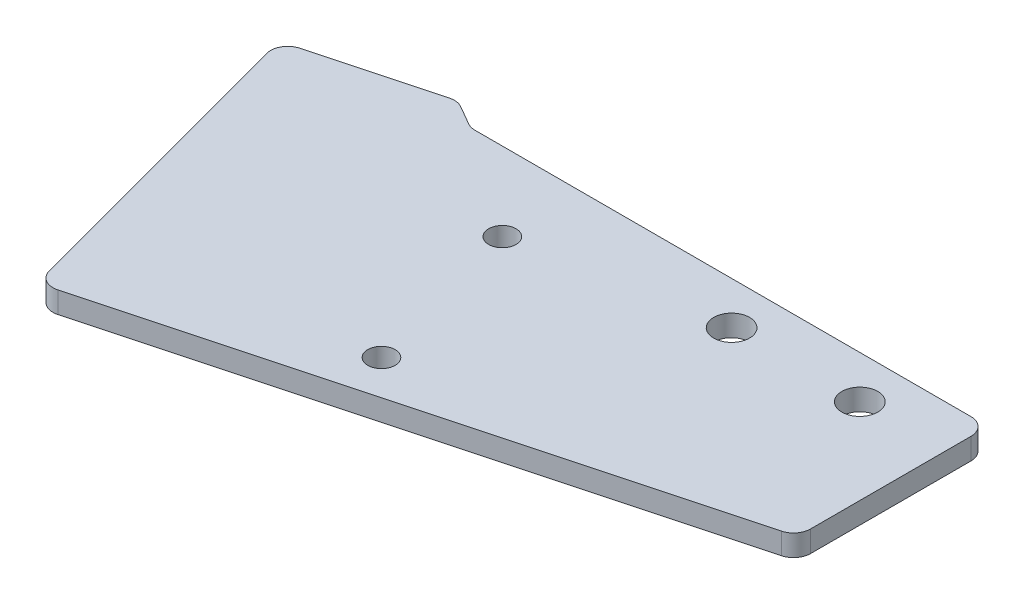
ISO-10303-21;
HEADER;
FILE_DESCRIPTION(('STEP AP214'),'2;1');
FILE_NAME('part.step','',(''),(''),'','','');
FILE_SCHEMA(('AUTOMOTIVE_DESIGN { 1 0 10303 214 1 1 1 1 }'));
ENDSEC;
DATA;
#1=APPLICATION_CONTEXT('core data for automotive mechanical design processes');
#2=APPLICATION_PROTOCOL_DEFINITION('international standard','automotive_design',2000,#1);
#3=PRODUCT_CONTEXT('',#1,'mechanical');
#4=PRODUCT('Part','Part','',(#3));
#5=PRODUCT_RELATED_PRODUCT_CATEGORY('part','',(#4));
#6=PRODUCT_DEFINITION_FORMATION('','',#4);
#7=PRODUCT_DEFINITION_CONTEXT('part definition',#1,'design');
#8=PRODUCT_DEFINITION('design','',#6,#7);
#9=PRODUCT_DEFINITION_SHAPE('','',#8);
#10=(LENGTH_UNIT() NAMED_UNIT(*) SI_UNIT(.MILLI.,.METRE.));
#11=(NAMED_UNIT(*) PLANE_ANGLE_UNIT() SI_UNIT($,.RADIAN.));
#12=(NAMED_UNIT(*) SI_UNIT($,.STERADIAN.) SOLID_ANGLE_UNIT());
#13=UNCERTAINTY_MEASURE_WITH_UNIT(LENGTH_MEASURE(1.E-05),#10,'distance_accuracy_value','');
#14=(GEOMETRIC_REPRESENTATION_CONTEXT(3) GLOBAL_UNCERTAINTY_ASSIGNED_CONTEXT((#13)) GLOBAL_UNIT_ASSIGNED_CONTEXT((#10,
#11,#12)) REPRESENTATION_CONTEXT('',''));
#15=CARTESIAN_POINT('',(0.,0.,0.));
#16=DIRECTION('',(0.,0.,1.));
#17=DIRECTION('',(1.,0.,0.));
#18=AXIS2_PLACEMENT_3D('',#15,#16,#17);
#19=CARTESIAN_POINT('',(0.,2.5,0.));
#20=DIRECTION('',(0.,1.,0.));
#21=DIRECTION('',(0.,0.,1.));
#22=AXIS2_PLACEMENT_3D('',#19,#20,#21);
#23=PLANE('',#22);
#24=CARTESIAN_POINT('',(-30.144179737197,2.5,4.17571846262339));
#25=DIRECTION('',(0.,1.,0.));
#26=DIRECTION('',(0.,0.,1.));
#27=AXIS2_PLACEMENT_3D('',#24,#25,#26);
#28=CIRCLE('',#27,1.6);
#29=CARTESIAN_POINT('',(-30.144179737197,2.5,5.77571846262339));
#30=VERTEX_POINT('',#29);
#31=EDGE_CURVE('E294',#30,#30,#28,.T.);
#32=ORIENTED_EDGE('',*,*,#31,.F.);
#33=EDGE_LOOP('',(#32));
#34=FACE_BOUND('',#33,.T.);
#35=CARTESIAN_POINT('',(-24.9677988351465,2.5,23.4942349884047));
#36=DIRECTION('',(0.,1.,0.));
#37=DIRECTION('',(0.,0.,1.));
#38=AXIS2_PLACEMENT_3D('',#35,#36,#37);
#39=CIRCLE('',#38,1.6);
#40=CARTESIAN_POINT('',(-24.9677988351465,2.5,25.0942349884047));
#41=VERTEX_POINT('',#40);
#42=EDGE_CURVE('E288',#41,#41,#39,.T.);
#43=ORIENTED_EDGE('',*,*,#42,.F.);
#44=EDGE_LOOP('',(#43));
#45=FACE_BOUND('',#44,.T.);
#46=CARTESIAN_POINT('',(-7.5,2.5,0.));
#47=DIRECTION('',(0.,1.,0.));
#48=DIRECTION('',(0.,0.,1.));
#49=AXIS2_PLACEMENT_3D('',#46,#47,#48);
#50=CIRCLE('',#49,2.1);
#51=CARTESIAN_POINT('',(-7.5,2.5,2.1));
#52=VERTEX_POINT('',#51);
#53=EDGE_CURVE('E261',#52,#52,#50,.T.);
#54=ORIENTED_EDGE('',*,*,#53,.F.);
#55=EDGE_LOOP('',(#54));
#56=FACE_BOUND('',#55,.T.);
#57=DIRECTION('',(0.965925826289067,0.,-0.258819045102525));
#58=VECTOR('',#57,1.);
#59=CARTESIAN_POINT('',(5.49512858894879,2.5,20.5080990880808));
#60=LINE('',#59,#58);
#61=CARTESIAN_POINT('',(-50.7196267457278,2.5,35.5707973827208));
#62=VERTEX_POINT('',#61);
#63=CARTESIAN_POINT('',(16.0176380902051,2.5,17.6886011648703));
#64=VERTEX_POINT('',#63);
#65=EDGE_CURVE('E187',#62,#64,#60,.T.);
#66=ORIENTED_EDGE('',*,*,#65,.T.);
#67=CARTESIAN_POINT('',(15.5,2.5,15.7567495122922));
#68=DIRECTION('',(0.,1.,0.));
#69=DIRECTION('',(0.,0.,1.));
#70=AXIS2_PLACEMENT_3D('',#67,#68,#69);
#71=CIRCLE('',#70,2.);
#72=CARTESIAN_POINT('',(17.5,2.5,15.7567495122922));
#73=VERTEX_POINT('',#72);
#74=EDGE_CURVE('E190',#64,#73,#71,.T.);
#75=ORIENTED_EDGE('',*,*,#74,.T.);
#76=DIRECTION('',(0.,0.,-1.));
#77=VECTOR('',#76,1.);
#78=CARTESIAN_POINT('',(17.5,2.5,-5.));
#79=LINE('',#78,#77);
#80=CARTESIAN_POINT('',(17.5,2.5,-3.));
#81=VERTEX_POINT('',#80);
#82=EDGE_CURVE('E257',#73,#81,#79,.T.);
#83=ORIENTED_EDGE('',*,*,#82,.T.);
#84=CARTESIAN_POINT('',(15.5,2.5,-3.));
#85=DIRECTION('',(0.,1.,0.));
#86=DIRECTION('',(0.,0.,1.));
#87=AXIS2_PLACEMENT_3D('',#84,#85,#86);
#88=CIRCLE('',#87,2.);
#89=CARTESIAN_POINT('',(15.5,2.5,-5.));
#90=VERTEX_POINT('',#89);
#91=EDGE_CURVE('E191',#81,#90,#88,.T.);
#92=ORIENTED_EDGE('',*,*,#91,.T.);
#93=DIRECTION('',(-1.,0.,0.));
#94=VECTOR('',#93,1.);
#95=CARTESIAN_POINT('',(-17.5,2.5,-5.));
#96=LINE('',#95,#94);
#97=CARTESIAN_POINT('',(-42.5178706563756,2.5,-5.));
#98=VERTEX_POINT('',#97);
#99=EDGE_CURVE('E240',#90,#98,#96,.T.);
#100=ORIENTED_EDGE('',*,*,#99,.T.);
#101=CARTESIAN_POINT('',(-42.5178706563756,2.5,-7.));
#102=DIRECTION('',(0.,1.,0.));
#103=DIRECTION('',(0.,0.,1.));
#104=AXIS2_PLACEMENT_3D('',#101,#102,#103);
#105=CIRCLE('',#104,2.);
#106=CARTESIAN_POINT('',(-43.5178706563756,2.5,-5.26794919243113));
#107=VERTEX_POINT('',#106);
#108=EDGE_CURVE('E81',#98,#107,#105,.F.);
#109=ORIENTED_EDGE('',*,*,#108,.T.);
#110=DIRECTION('',(0.866025403784438,0.,0.500000000000001));
#111=VECTOR('',#110,1.);
#112=CARTESIAN_POINT('',(-8.59837875084842,2.5,14.89282885919));
#113=LINE('',#112,#111);
#114=CARTESIAN_POINT('',(-45.7603358534579,2.5,-6.56263707761494));
#115=VERTEX_POINT('',#114);
#116=EDGE_CURVE('E237',#107,#115,#113,.F.);
#117=ORIENTED_EDGE('',*,*,#116,.T.);
#118=CARTESIAN_POINT('',(-46.7603358534579,2.5,-4.83058627004606));
#119=DIRECTION('',(0.,1.,0.));
#120=DIRECTION('',(0.,0.,1.));
#121=AXIS2_PLACEMENT_3D('',#118,#119,#120);
#122=CIRCLE('',#121,2.);
#123=CARTESIAN_POINT('',(-47.2779739436629,2.5,-6.76243792262419));
#124=VERTEX_POINT('',#123);
#125=EDGE_CURVE('E193',#115,#124,#122,.T.);
#126=ORIENTED_EDGE('',*,*,#125,.T.);
#127=DIRECTION('',(0.965925826289067,0.,-0.258819045102525));
#128=VECTOR('',#127,1.);
#129=CARTESIAN_POINT('',(-4.85763321515222,2.5,-18.1289339634819));
#130=LINE('',#129,#128);
#131=CARTESIAN_POINT('',(-61.0723885498288,2.5,-3.06623566884191));
#132=VERTEX_POINT('',#131);
#133=EDGE_CURVE('E277',#132,#124,#130,.T.);
#134=ORIENTED_EDGE('',*,*,#133,.F.);
#135=CARTESIAN_POINT('',(-60.5547504596237,2.5,-1.13438401626378));
#136=DIRECTION('',(0.,1.,0.));
#137=DIRECTION('',(0.,0.,1.));
#138=AXIS2_PLACEMENT_3D('',#135,#136,#137);
#139=CIRCLE('',#138,2.);
#140=CARTESIAN_POINT('',(-62.4866021122018,2.5,-0.61674592605874));
#141=VERTEX_POINT('',#140);
#142=EDGE_CURVE('E200',#132,#141,#139,.T.);
#143=ORIENTED_EDGE('',*,*,#142,.T.);
#144=DIRECTION('',(-0.258819045102525,0.,-0.965925826289067));
#145=VECTOR('',#144,1.);
#146=CARTESIAN_POINT('',(-58.1466069872547,2.5,15.580336384845));
#147=LINE('',#146,#145);
#148=CARTESIAN_POINT('',(-53.1691164885109,2.5,34.1565838203477));
#149=VERTEX_POINT('',#148);
#150=EDGE_CURVE('E278',#149,#141,#147,.T.);
#151=ORIENTED_EDGE('',*,*,#150,.F.);
#152=CARTESIAN_POINT('',(-51.2372648359328,2.5,33.6389457301426));
#153=DIRECTION('',(0.,1.,0.));
#154=DIRECTION('',(0.,0.,1.));
#155=AXIS2_PLACEMENT_3D('',#152,#153,#154);
#156=CIRCLE('',#155,2.);
#157=EDGE_CURVE('E202',#149,#62,#156,.T.);
#158=ORIENTED_EDGE('',*,*,#157,.T.);
#159=EDGE_LOOP('',(#66,#75,#83,#92,#100,#109,#117,#126,#134,#143,#151,#158));
#160=FACE_BOUND('',#159,.T.);
#161=CARTESIAN_POINT('',(7.5,2.5,0.));
#162=DIRECTION('',(0.,1.,0.));
#163=DIRECTION('',(0.,0.,1.));
#164=AXIS2_PLACEMENT_3D('',#161,#162,#163);
#165=CIRCLE('',#164,2.1);
#166=CARTESIAN_POINT('',(7.5,2.5,2.1));
#167=VERTEX_POINT('',#166);
#168=EDGE_CURVE('E268',#167,#167,#165,.T.);
#169=ORIENTED_EDGE('',*,*,#168,.F.);
#170=EDGE_LOOP('',(#169));
#171=FACE_BOUND('',#170,.T.);
#172=ADVANCED_FACE('F73',(#34,#45,#56,#160,#171),#23,.T.);
#173=CARTESIAN_POINT('',(0.,0.,0.));
#174=DIRECTION('',(0.,1.,0.));
#175=DIRECTION('',(0.,0.,1.));
#176=AXIS2_PLACEMENT_3D('',#173,#174,#175);
#177=PLANE('',#176);
#178=CARTESIAN_POINT('',(-30.144179737197,0.,4.17571846262339));
#179=DIRECTION('',(0.,1.,0.));
#180=DIRECTION('',(0.,0.,1.));
#181=AXIS2_PLACEMENT_3D('',#178,#179,#180);
#182=CIRCLE('',#181,1.6);
#183=CARTESIAN_POINT('',(-30.144179737197,0.,5.77571846262339));
#184=VERTEX_POINT('',#183);
#185=EDGE_CURVE('E281',#184,#184,#182,.T.);
#186=ORIENTED_EDGE('',*,*,#185,.T.);
#187=EDGE_LOOP('',(#186));
#188=FACE_BOUND('',#187,.T.);
#189=CARTESIAN_POINT('',(-24.9677988351465,0.,23.4942349884047));
#190=DIRECTION('',(0.,1.,0.));
#191=DIRECTION('',(0.,0.,1.));
#192=AXIS2_PLACEMENT_3D('',#189,#190,#191);
#193=CIRCLE('',#192,1.6);
#194=CARTESIAN_POINT('',(-24.9677988351465,0.,25.0942349884047));
#195=VERTEX_POINT('',#194);
#196=EDGE_CURVE('E291',#195,#195,#193,.T.);
#197=ORIENTED_EDGE('',*,*,#196,.T.);
#198=EDGE_LOOP('',(#197));
#199=FACE_BOUND('',#198,.T.);
#200=DIRECTION('',(0.,0.,-1.));
#201=VECTOR('',#200,1.);
#202=CARTESIAN_POINT('',(17.5,0.,-5.));
#203=LINE('',#202,#201);
#204=CARTESIAN_POINT('',(17.5,0.,15.7567495122922));
#205=VERTEX_POINT('',#204);
#206=CARTESIAN_POINT('',(17.5,0.,-3.));
#207=VERTEX_POINT('',#206);
#208=EDGE_CURVE('E171',#205,#207,#203,.T.);
#209=ORIENTED_EDGE('',*,*,#208,.F.);
#210=CARTESIAN_POINT('',(15.5,0.,15.7567495122922));
#211=DIRECTION('',(0.,1.,0.));
#212=DIRECTION('',(0.,0.,1.));
#213=AXIS2_PLACEMENT_3D('',#210,#211,#212);
#214=CIRCLE('',#213,2.);
#215=CARTESIAN_POINT('',(16.0176380902051,0.,17.6886011648703));
#216=VERTEX_POINT('',#215);
#217=EDGE_CURVE('E164',#205,#216,#214,.F.);
#218=ORIENTED_EDGE('',*,*,#217,.T.);
#219=DIRECTION('',(-0.965925826289067,0.,0.258819045102525));
#220=VECTOR('',#219,1.);
#221=CARTESIAN_POINT('',(5.49512858894879,0.,20.5080990880808));
#222=LINE('',#221,#220);
#223=CARTESIAN_POINT('',(-50.7196267457278,0.,35.5707973827208));
#224=VERTEX_POINT('',#223);
#225=EDGE_CURVE('E168',#216,#224,#222,.T.);
#226=ORIENTED_EDGE('',*,*,#225,.T.);
#227=CARTESIAN_POINT('',(-51.2372648359328,0.,33.6389457301426));
#228=DIRECTION('',(0.,1.,0.));
#229=DIRECTION('',(0.,0.,1.));
#230=AXIS2_PLACEMENT_3D('',#227,#228,#229);
#231=CIRCLE('',#230,2.);
#232=CARTESIAN_POINT('',(-53.1691164885109,0.,34.1565838203477));
#233=VERTEX_POINT('',#232);
#234=EDGE_CURVE('E176',#224,#233,#231,.F.);
#235=ORIENTED_EDGE('',*,*,#234,.T.);
#236=DIRECTION('',(0.258819045102525,0.,0.965925826289067));
#237=VECTOR('',#236,1.);
#238=CARTESIAN_POINT('',(-58.1466069872547,0.,15.580336384845));
#239=LINE('',#238,#237);
#240=CARTESIAN_POINT('',(-62.4866021122018,0.,-0.61674592605874));
#241=VERTEX_POINT('',#240);
#242=EDGE_CURVE('E279',#241,#233,#239,.T.);
#243=ORIENTED_EDGE('',*,*,#242,.F.);
#244=CARTESIAN_POINT('',(-60.5547504596237,0.,-1.13438401626378));
#245=DIRECTION('',(0.,1.,0.));
#246=DIRECTION('',(0.,0.,1.));
#247=AXIS2_PLACEMENT_3D('',#244,#245,#246);
#248=CIRCLE('',#247,2.);
#249=CARTESIAN_POINT('',(-61.0723885498288,0.,-3.06623566884191));
#250=VERTEX_POINT('',#249);
#251=EDGE_CURVE('E88',#241,#250,#248,.F.);
#252=ORIENTED_EDGE('',*,*,#251,.T.);
#253=DIRECTION('',(-0.965925826289067,0.,0.258819045102525));
#254=VECTOR('',#253,1.);
#255=CARTESIAN_POINT('',(-4.85763321515222,0.,-18.1289339634819));
#256=LINE('',#255,#254);
#257=CARTESIAN_POINT('',(-47.2779739436629,0.,-6.76243792262419));
#258=VERTEX_POINT('',#257);
#259=EDGE_CURVE('E275',#258,#250,#256,.T.);
#260=ORIENTED_EDGE('',*,*,#259,.F.);
#261=CARTESIAN_POINT('',(-46.7603358534579,0.,-4.83058627004606));
#262=DIRECTION('',(0.,1.,0.));
#263=DIRECTION('',(0.,0.,1.));
#264=AXIS2_PLACEMENT_3D('',#261,#262,#263);
#265=CIRCLE('',#264,2.);
#266=CARTESIAN_POINT('',(-45.7603358534579,0.,-6.56263707761494));
#267=VERTEX_POINT('',#266);
#268=EDGE_CURVE('E96',#258,#267,#265,.F.);
#269=ORIENTED_EDGE('',*,*,#268,.T.);
#270=DIRECTION('',(-0.866025403784438,0.,-0.500000000000001));
#271=VECTOR('',#270,1.);
#272=CARTESIAN_POINT('',(-17.5,0.,9.75347543476826));
#273=LINE('',#272,#271);
#274=CARTESIAN_POINT('',(-43.5178706563756,0.,-5.26794919243113));
#275=VERTEX_POINT('',#274);
#276=EDGE_CURVE('E195',#267,#275,#273,.F.);
#277=ORIENTED_EDGE('',*,*,#276,.T.);
#278=CARTESIAN_POINT('',(-42.5178706563756,0.,-7.));
#279=DIRECTION('',(0.,1.,0.));
#280=DIRECTION('',(0.,0.,1.));
#281=AXIS2_PLACEMENT_3D('',#278,#279,#280);
#282=CIRCLE('',#281,2.);
#283=CARTESIAN_POINT('',(-42.5178706563756,0.,-5.));
#284=VERTEX_POINT('',#283);
#285=EDGE_CURVE('E12',#275,#284,#282,.T.);
#286=ORIENTED_EDGE('',*,*,#285,.T.);
#287=DIRECTION('',(-1.,0.,0.));
#288=VECTOR('',#287,1.);
#289=CARTESIAN_POINT('',(-17.5,0.,-5.));
#290=LINE('',#289,#288);
#291=CARTESIAN_POINT('',(15.5,0.,-5.));
#292=VERTEX_POINT('',#291);
#293=EDGE_CURVE('E253',#292,#284,#290,.T.);
#294=ORIENTED_EDGE('',*,*,#293,.F.);
#295=CARTESIAN_POINT('',(15.5,0.,-3.));
#296=DIRECTION('',(0.,1.,0.));
#297=DIRECTION('',(0.,0.,1.));
#298=AXIS2_PLACEMENT_3D('',#295,#296,#297);
#299=CIRCLE('',#298,2.);
#300=EDGE_CURVE('E209',#292,#207,#299,.F.);
#301=ORIENTED_EDGE('',*,*,#300,.T.);
#302=EDGE_LOOP('',(#209,#218,#226,#235,#243,#252,#260,#269,#277,#286,#294,#301));
#303=FACE_BOUND('',#302,.T.);
#304=CARTESIAN_POINT('',(-7.5,0.,0.));
#305=DIRECTION('',(0.,1.,0.));
#306=DIRECTION('',(0.,0.,1.));
#307=AXIS2_PLACEMENT_3D('',#304,#305,#306);
#308=CIRCLE('',#307,2.1);
#309=CARTESIAN_POINT('',(-7.5,0.,2.1));
#310=VERTEX_POINT('',#309);
#311=EDGE_CURVE('E265',#310,#310,#308,.T.);
#312=ORIENTED_EDGE('',*,*,#311,.T.);
#313=EDGE_LOOP('',(#312));
#314=FACE_BOUND('',#313,.T.);
#315=CARTESIAN_POINT('',(7.5,0.,0.));
#316=DIRECTION('',(0.,1.,0.));
#317=DIRECTION('',(0.,0.,1.));
#318=AXIS2_PLACEMENT_3D('',#315,#316,#317);
#319=CIRCLE('',#318,2.1);
#320=CARTESIAN_POINT('',(7.5,0.,2.1));
#321=VERTEX_POINT('',#320);
#322=EDGE_CURVE('E186',#321,#321,#319,.T.);
#323=ORIENTED_EDGE('',*,*,#322,.T.);
#324=EDGE_LOOP('',(#323));
#325=FACE_BOUND('',#324,.T.);
#326=ADVANCED_FACE('F166',(#188,#199,#303,#314,#325),#177,.F.);
#327=CARTESIAN_POINT('',(17.5,2.5,-5.));
#328=DIRECTION('',(-1.,0.,0.));
#329=DIRECTION('',(0.,0.,1.));
#330=AXIS2_PLACEMENT_3D('',#327,#328,#329);
#331=PLANE('',#330);
#332=ORIENTED_EDGE('',*,*,#82,.F.);
#333=DIRECTION('',(0.,1.,0.));
#334=VECTOR('',#333,1.);
#335=CARTESIAN_POINT('',(17.5,0.,15.7567495122922));
#336=LINE('',#335,#334);
#337=EDGE_CURVE('E207',#73,#205,#336,.F.);
#338=ORIENTED_EDGE('',*,*,#337,.T.);
#339=ORIENTED_EDGE('',*,*,#208,.T.);
#340=DIRECTION('',(0.,-1.,0.));
#341=VECTOR('',#340,1.);
#342=CARTESIAN_POINT('',(17.5,2.5,-3.));
#343=LINE('',#342,#341);
#344=EDGE_CURVE('E205',#207,#81,#343,.F.);
#345=ORIENTED_EDGE('',*,*,#344,.T.);
#346=EDGE_LOOP('',(#332,#338,#339,#345));
#347=FACE_BOUND('',#346,.T.);
#348=ADVANCED_FACE('F324',(#347),#331,.F.);
#349=CARTESIAN_POINT('',(-17.5,2.5,-5.));
#350=DIRECTION('',(0.,0.,1.));
#351=DIRECTION('',(1.,0.,0.));
#352=AXIS2_PLACEMENT_3D('',#349,#350,#351);
#353=PLANE('',#352);
#354=ORIENTED_EDGE('',*,*,#293,.T.);
#355=DIRECTION('',(0.,-1.,0.));
#356=VECTOR('',#355,1.);
#357=CARTESIAN_POINT('',(-42.5178706563756,2.5,-5.));
#358=LINE('',#357,#356);
#359=EDGE_CURVE('E230',#284,#98,#358,.F.);
#360=ORIENTED_EDGE('',*,*,#359,.T.);
#361=ORIENTED_EDGE('',*,*,#99,.F.);
#362=DIRECTION('',(0.,-1.,0.));
#363=VECTOR('',#362,1.);
#364=CARTESIAN_POINT('',(15.5,2.5,-5.));
#365=LINE('',#364,#363);
#366=EDGE_CURVE('E227',#90,#292,#365,.T.);
#367=ORIENTED_EDGE('',*,*,#366,.T.);
#368=EDGE_LOOP('',(#354,#360,#361,#367));
#369=FACE_BOUND('',#368,.T.);
#370=ADVANCED_FACE('F255',(#369),#353,.F.);
#371=CARTESIAN_POINT('',(-7.5,2.5,0.));
#372=DIRECTION('',(0.,-1.,0.));
#373=DIRECTION('',(0.,0.,-1.));
#374=AXIS2_PLACEMENT_3D('',#371,#372,#373);
#375=CYLINDRICAL_SURFACE('',#374,2.1);
#376=ORIENTED_EDGE('',*,*,#53,.T.);
#377=EDGE_LOOP('',(#376));
#378=FACE_BOUND('',#377,.T.);
#379=ORIENTED_EDGE('',*,*,#311,.F.);
#380=EDGE_LOOP('',(#379));
#381=FACE_BOUND('',#380,.T.);
#382=ADVANCED_FACE('F316',(#378,#381),#375,.F.);
#383=CARTESIAN_POINT('',(7.5,2.5,0.));
#384=DIRECTION('',(0.,-1.,0.));
#385=DIRECTION('',(0.,0.,-1.));
#386=AXIS2_PLACEMENT_3D('',#383,#384,#385);
#387=CYLINDRICAL_SURFACE('',#386,2.1);
#388=ORIENTED_EDGE('',*,*,#168,.T.);
#389=EDGE_LOOP('',(#388));
#390=FACE_BOUND('',#389,.T.);
#391=ORIENTED_EDGE('',*,*,#322,.F.);
#392=EDGE_LOOP('',(#391));
#393=FACE_BOUND('',#392,.T.);
#394=ADVANCED_FACE('F319',(#390,#393),#387,.F.);
#395=CARTESIAN_POINT('',(5.49512858894879,-95.2082302145127,20.5080990880808));
#396=DIRECTION('',(0.258819045102525,0.,0.965925826289067));
#397=DIRECTION('',(0.965925826289067,0.,-0.258819045102525));
#398=AXIS2_PLACEMENT_3D('',#395,#396,#397);
#399=PLANE('',#398);
#400=ORIENTED_EDGE('',*,*,#225,.F.);
#401=DIRECTION('',(0.,1.,0.));
#402=VECTOR('',#401,1.);
#403=CARTESIAN_POINT('',(16.0176380902051,2.5,17.6886011648703));
#404=LINE('',#403,#402);
#405=EDGE_CURVE('E182',#216,#64,#404,.T.);
#406=ORIENTED_EDGE('',*,*,#405,.T.);
#407=ORIENTED_EDGE('',*,*,#65,.F.);
#408=DIRECTION('',(0.,1.,0.));
#409=VECTOR('',#408,1.);
#410=CARTESIAN_POINT('',(-50.7196267457277,0.,35.5707973827208));
#411=LINE('',#410,#409);
#412=EDGE_CURVE('E185',#62,#224,#411,.F.);
#413=ORIENTED_EDGE('',*,*,#412,.T.);
#414=EDGE_LOOP('',(#400,#406,#407,#413));
#415=FACE_BOUND('',#414,.T.);
#416=ADVANCED_FACE('F180',(#415),#399,.T.);
#417=CARTESIAN_POINT('',(-58.1466069872547,-95.2082302145127,15.580336384845));
#418=DIRECTION('',(0.965925826289067,0.,-0.258819045102525));
#419=DIRECTION('',(-0.258819045102525,0.,-0.965925826289067));
#420=AXIS2_PLACEMENT_3D('',#417,#418,#419);
#421=PLANE('',#420);
#422=ORIENTED_EDGE('',*,*,#242,.T.);
#423=DIRECTION('',(0.,1.,0.));
#424=VECTOR('',#423,1.);
#425=CARTESIAN_POINT('',(-53.1691164885109,2.5,34.1565838203477));
#426=LINE('',#425,#424);
#427=EDGE_CURVE('E215',#233,#149,#426,.T.);
#428=ORIENTED_EDGE('',*,*,#427,.T.);
#429=ORIENTED_EDGE('',*,*,#150,.T.);
#430=DIRECTION('',(0.,1.,0.));
#431=VECTOR('',#430,1.);
#432=CARTESIAN_POINT('',(-62.4866021122018,-95.2082302145127,-0.616745926058737));
#433=LINE('',#432,#431);
#434=EDGE_CURVE('E175',#141,#241,#433,.F.);
#435=ORIENTED_EDGE('',*,*,#434,.T.);
#436=EDGE_LOOP('',(#422,#428,#429,#435));
#437=FACE_BOUND('',#436,.T.);
#438=ADVANCED_FACE('F334',(#437),#421,.F.);
#439=CARTESIAN_POINT('',(-4.85763321515222,-95.2082302145127,-18.1289339634819));
#440=DIRECTION('',(0.258819045102525,0.,0.965925826289067));
#441=DIRECTION('',(0.965925826289067,0.,-0.258819045102525));
#442=AXIS2_PLACEMENT_3D('',#439,#440,#441);
#443=PLANE('',#442);
#444=ORIENTED_EDGE('',*,*,#259,.T.);
#445=DIRECTION('',(0.,1.,0.));
#446=VECTOR('',#445,1.);
#447=CARTESIAN_POINT('',(-61.0723885498288,-95.2082302145127,-3.06623566884191));
#448=LINE('',#447,#446);
#449=EDGE_CURVE('E220',#250,#132,#448,.T.);
#450=ORIENTED_EDGE('',*,*,#449,.T.);
#451=ORIENTED_EDGE('',*,*,#133,.T.);
#452=DIRECTION('',(0.,1.,0.));
#453=VECTOR('',#452,1.);
#454=CARTESIAN_POINT('',(-47.2779739436629,0.,-6.7624379226242));
#455=LINE('',#454,#453);
#456=EDGE_CURVE('E218',#124,#258,#455,.F.);
#457=ORIENTED_EDGE('',*,*,#456,.T.);
#458=EDGE_LOOP('',(#444,#450,#451,#457));
#459=FACE_BOUND('',#458,.T.);
#460=ADVANCED_FACE('F378',(#459),#443,.F.);
#461=CARTESIAN_POINT('',(-24.9677988351465,0.,23.4942349884047));
#462=DIRECTION('',(0.,1.,0.));
#463=DIRECTION('',(0.,0.,1.));
#464=AXIS2_PLACEMENT_3D('',#461,#462,#463);
#465=CYLINDRICAL_SURFACE('',#464,1.6);
#466=ORIENTED_EDGE('',*,*,#196,.F.);
#467=EDGE_LOOP('',(#466));
#468=FACE_BOUND('',#467,.T.);
#469=ORIENTED_EDGE('',*,*,#42,.T.);
#470=EDGE_LOOP('',(#469));
#471=FACE_BOUND('',#470,.T.);
#472=ADVANCED_FACE('F305',(#468,#471),#465,.F.);
#473=CARTESIAN_POINT('',(-30.144179737197,0.,4.17571846262339));
#474=DIRECTION('',(0.,1.,0.));
#475=DIRECTION('',(0.,0.,1.));
#476=AXIS2_PLACEMENT_3D('',#473,#474,#475);
#477=CYLINDRICAL_SURFACE('',#476,1.6);
#478=ORIENTED_EDGE('',*,*,#185,.F.);
#479=EDGE_LOOP('',(#478));
#480=FACE_BOUND('',#479,.T.);
#481=ORIENTED_EDGE('',*,*,#31,.T.);
#482=EDGE_LOOP('',(#481));
#483=FACE_BOUND('',#482,.T.);
#484=ADVANCED_FACE('F302',(#480,#483),#477,.F.);
#485=CARTESIAN_POINT('',(-17.5,-95.2082302145127,9.75347543476826));
#486=DIRECTION('',(-0.500000000000001,0.,0.866025403784438));
#487=DIRECTION('',(0.,1.,0.));
#488=AXIS2_PLACEMENT_3D('',#485,#486,#487);
#489=PLANE('',#488);
#490=ORIENTED_EDGE('',*,*,#276,.F.);
#491=DIRECTION('',(0.,-1.,0.));
#492=VECTOR('',#491,1.);
#493=CARTESIAN_POINT('',(-45.7603358534579,2.5,-6.56263707761493));
#494=LINE('',#493,#492);
#495=EDGE_CURVE('E225',#267,#115,#494,.F.);
#496=ORIENTED_EDGE('',*,*,#495,.T.);
#497=ORIENTED_EDGE('',*,*,#116,.F.);
#498=DIRECTION('',(0.,1.,0.));
#499=VECTOR('',#498,1.);
#500=CARTESIAN_POINT('',(-43.5178706563756,-95.2082302145127,-5.26794919243112));
#501=LINE('',#500,#499);
#502=EDGE_CURVE('E223',#107,#275,#501,.F.);
#503=ORIENTED_EDGE('',*,*,#502,.T.);
#504=EDGE_LOOP('',(#490,#496,#497,#503));
#505=FACE_BOUND('',#504,.T.);
#506=ADVANCED_FACE('F246',(#505),#489,.F.);
#507=CARTESIAN_POINT('',(15.5,-95.2082302145127,15.7567495122922));
#508=DIRECTION('',(0.,-1.,0.));
#509=DIRECTION('',(0.,0.,-1.));
#510=AXIS2_PLACEMENT_3D('',#507,#508,#509);
#511=CYLINDRICAL_SURFACE('',#510,2.);
#512=ORIENTED_EDGE('',*,*,#217,.F.);
#513=ORIENTED_EDGE('',*,*,#337,.F.);
#514=ORIENTED_EDGE('',*,*,#74,.F.);
#515=ORIENTED_EDGE('',*,*,#405,.F.);
#516=EDGE_LOOP('',(#512,#513,#514,#515));
#517=FACE_BOUND('',#516,.T.);
#518=ADVANCED_FACE('F189',(#517),#511,.T.);
#519=CARTESIAN_POINT('',(-51.2372648359328,-95.2082302145127,33.6389457301426));
#520=DIRECTION('',(0.,-1.,0.));
#521=DIRECTION('',(0.,0.,-1.));
#522=AXIS2_PLACEMENT_3D('',#519,#520,#521);
#523=CYLINDRICAL_SURFACE('',#522,2.);
#524=ORIENTED_EDGE('',*,*,#234,.F.);
#525=ORIENTED_EDGE('',*,*,#412,.F.);
#526=ORIENTED_EDGE('',*,*,#157,.F.);
#527=ORIENTED_EDGE('',*,*,#427,.F.);
#528=EDGE_LOOP('',(#524,#525,#526,#527));
#529=FACE_BOUND('',#528,.T.);
#530=ADVANCED_FACE('F351',(#529),#523,.T.);
#531=CARTESIAN_POINT('',(-60.5547504596237,-95.2082302145127,-1.13438401626378));
#532=DIRECTION('',(0.,1.,0.));
#533=DIRECTION('',(0.,0.,1.));
#534=AXIS2_PLACEMENT_3D('',#531,#532,#533);
#535=CYLINDRICAL_SURFACE('',#534,2.);
#536=ORIENTED_EDGE('',*,*,#251,.F.);
#537=ORIENTED_EDGE('',*,*,#434,.F.);
#538=ORIENTED_EDGE('',*,*,#142,.F.);
#539=ORIENTED_EDGE('',*,*,#449,.F.);
#540=EDGE_LOOP('',(#536,#537,#538,#539));
#541=FACE_BOUND('',#540,.T.);
#542=ADVANCED_FACE('F354',(#541),#535,.T.);
#543=CARTESIAN_POINT('',(-46.7603358534579,-95.2082302145127,-4.83058627004606));
#544=DIRECTION('',(0.,-1.,0.));
#545=DIRECTION('',(0.,0.,-1.));
#546=AXIS2_PLACEMENT_3D('',#543,#544,#545);
#547=CYLINDRICAL_SURFACE('',#546,2.);
#548=ORIENTED_EDGE('',*,*,#125,.F.);
#549=ORIENTED_EDGE('',*,*,#495,.F.);
#550=ORIENTED_EDGE('',*,*,#268,.F.);
#551=ORIENTED_EDGE('',*,*,#456,.F.);
#552=EDGE_LOOP('',(#548,#549,#550,#551));
#553=FACE_BOUND('',#552,.T.);
#554=ADVANCED_FACE('F358',(#553),#547,.T.);
#555=CARTESIAN_POINT('',(-42.5178706563756,2.5,-7.));
#556=DIRECTION('',(0.,-1.,0.));
#557=DIRECTION('',(0.,0.,-1.));
#558=AXIS2_PLACEMENT_3D('',#555,#556,#557);
#559=CYLINDRICAL_SURFACE('',#558,2.);
#560=ORIENTED_EDGE('',*,*,#285,.F.);
#561=ORIENTED_EDGE('',*,*,#502,.F.);
#562=ORIENTED_EDGE('',*,*,#108,.F.);
#563=ORIENTED_EDGE('',*,*,#359,.F.);
#564=EDGE_LOOP('',(#560,#561,#562,#563));
#565=FACE_BOUND('',#564,.T.);
#566=ADVANCED_FACE('F250',(#565),#559,.F.);
#567=CARTESIAN_POINT('',(15.5,2.5,-3.));
#568=DIRECTION('',(0.,-1.,0.));
#569=DIRECTION('',(0.,0.,-1.));
#570=AXIS2_PLACEMENT_3D('',#567,#568,#569);
#571=CYLINDRICAL_SURFACE('',#570,2.);
#572=ORIENTED_EDGE('',*,*,#91,.F.);
#573=ORIENTED_EDGE('',*,*,#344,.F.);
#574=ORIENTED_EDGE('',*,*,#300,.F.);
#575=ORIENTED_EDGE('',*,*,#366,.F.);
#576=EDGE_LOOP('',(#572,#573,#574,#575));
#577=FACE_BOUND('',#576,.T.);
#578=ADVANCED_FACE('F75',(#577),#571,.T.);
#579=CLOSED_SHELL('',(#172,#326,#348,#370,#382,#394,#416,#438,#460,#472,#484,#506,#518,#530,
#542,#554,#566,#578));
#580=MANIFOLD_SOLID_BREP('B2',#579);
#581=ADVANCED_BREP_SHAPE_REPRESENTATION('',(#18,#580),#14);
#582=SHAPE_DEFINITION_REPRESENTATION(#9,#581);
ENDSEC;
END-ISO-10303-21;
